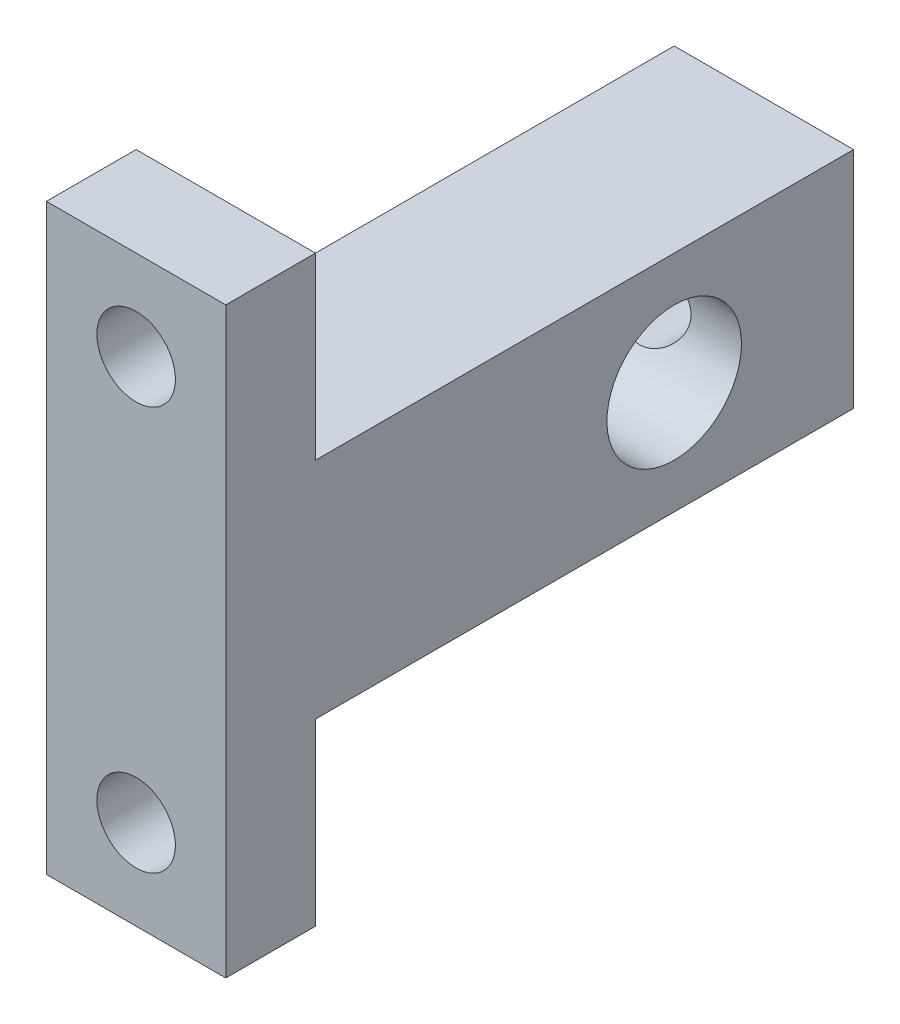
ISO-10303-21;
HEADER;
FILE_DESCRIPTION(('STEP AP214'),'2;1');
FILE_NAME('part.step','',(''),(''),'','','');
FILE_SCHEMA(('AUTOMOTIVE_DESIGN { 1 0 10303 214 1 1 1 1 }'));
ENDSEC;
DATA;
#1=APPLICATION_CONTEXT('core data for automotive mechanical design processes');
#2=APPLICATION_PROTOCOL_DEFINITION('international standard','automotive_design',2000,#1);
#3=PRODUCT_CONTEXT('',#1,'mechanical');
#4=PRODUCT('Part','Part','',(#3));
#5=PRODUCT_RELATED_PRODUCT_CATEGORY('part','',(#4));
#6=PRODUCT_DEFINITION_FORMATION('','',#4);
#7=PRODUCT_DEFINITION_CONTEXT('part definition',#1,'design');
#8=PRODUCT_DEFINITION('design','',#6,#7);
#9=PRODUCT_DEFINITION_SHAPE('','',#8);
#10=(LENGTH_UNIT() NAMED_UNIT(*) SI_UNIT(.MILLI.,.METRE.));
#11=(NAMED_UNIT(*) PLANE_ANGLE_UNIT() SI_UNIT($,.RADIAN.));
#12=(NAMED_UNIT(*) SI_UNIT($,.STERADIAN.) SOLID_ANGLE_UNIT());
#13=UNCERTAINTY_MEASURE_WITH_UNIT(LENGTH_MEASURE(1.E-05),#10,'distance_accuracy_value','');
#14=(GEOMETRIC_REPRESENTATION_CONTEXT(3) GLOBAL_UNCERTAINTY_ASSIGNED_CONTEXT((#13)) GLOBAL_UNIT_ASSIGNED_CONTEXT((#10,
#11,#12)) REPRESENTATION_CONTEXT('',''));
#15=CARTESIAN_POINT('',(0.,0.,0.));
#16=DIRECTION('',(0.,0.,1.));
#17=DIRECTION('',(1.,0.,0.));
#18=AXIS2_PLACEMENT_3D('',#15,#16,#17);
#19=CARTESIAN_POINT('',(0.,0.,0.));
#20=DIRECTION('',(0.,0.,1.));
#21=DIRECTION('',(1.,0.,0.));
#22=AXIS2_PLACEMENT_3D('',#19,#20,#21);
#23=PLANE('',#22);
#24=CARTESIAN_POINT('',(0.,-9.,0.));
#25=DIRECTION('',(0.,0.,-1.));
#26=DIRECTION('',(-1.,0.,0.));
#27=AXIS2_PLACEMENT_3D('',#24,#25,#26);
#28=CIRCLE('',#27,1.75);
#29=CARTESIAN_POINT('',(-1.75,-9.,0.));
#30=VERTEX_POINT('',#29);
#31=EDGE_CURVE('E127',#30,#30,#28,.T.);
#32=ORIENTED_EDGE('',*,*,#31,.F.);
#33=EDGE_LOOP('',(#32));
#34=FACE_BOUND('',#33,.T.);
#35=DIRECTION('',(-1.,0.,0.));
#36=VECTOR('',#35,1.);
#37=CARTESIAN_POINT('',(4.,-5.,0.));
#38=LINE('',#37,#36);
#39=CARTESIAN_POINT('',(4.,-4.99999999999999,0.));
#40=VERTEX_POINT('',#39);
#41=CARTESIAN_POINT('',(-4.,-4.99999999999999,0.));
#42=VERTEX_POINT('',#41);
#43=EDGE_CURVE('E122',#40,#42,#38,.T.);
#44=ORIENTED_EDGE('',*,*,#43,.F.);
#45=DIRECTION('',(0.,1.,0.));
#46=VECTOR('',#45,1.);
#47=CARTESIAN_POINT('',(4.,13.,0.));
#48=LINE('',#47,#46);
#49=CARTESIAN_POINT('',(4.,-13.,0.));
#50=VERTEX_POINT('',#49);
#51=EDGE_CURVE('E176',#50,#40,#48,.T.);
#52=ORIENTED_EDGE('',*,*,#51,.F.);
#53=DIRECTION('',(1.,0.,0.));
#54=VECTOR('',#53,1.);
#55=CARTESIAN_POINT('',(-4.,-13.,0.));
#56=LINE('',#55,#54);
#57=CARTESIAN_POINT('',(-4.,-13.,0.));
#58=VERTEX_POINT('',#57);
#59=EDGE_CURVE('E161',#58,#50,#56,.T.);
#60=ORIENTED_EDGE('',*,*,#59,.F.);
#61=DIRECTION('',(0.,-1.,0.));
#62=VECTOR('',#61,1.);
#63=CARTESIAN_POINT('',(-4.,13.,0.));
#64=LINE('',#63,#62);
#65=EDGE_CURVE('E52',#42,#58,#64,.T.);
#66=ORIENTED_EDGE('',*,*,#65,.F.);
#67=EDGE_LOOP('',(#44,#52,#60,#66));
#68=FACE_BOUND('',#67,.T.);
#69=ADVANCED_FACE('F35',(#34,#68),#23,.F.);
#70=CARTESIAN_POINT('',(0.,9.,0.));
#71=DIRECTION('',(0.,0.,-1.));
#72=DIRECTION('',(-1.,0.,0.));
#73=AXIS2_PLACEMENT_3D('',#70,#71,#72);
#74=CIRCLE('',#73,1.75);
#75=CARTESIAN_POINT('',(-1.75,9.,0.));
#76=VERTEX_POINT('',#75);
#77=EDGE_CURVE('E149',#76,#76,#74,.T.);
#78=ORIENTED_EDGE('',*,*,#77,.F.);
#79=EDGE_LOOP('',(#78));
#80=FACE_BOUND('',#79,.T.);
#81=DIRECTION('',(1.,0.,0.));
#82=VECTOR('',#81,1.);
#83=CARTESIAN_POINT('',(4.,5.,0.));
#84=LINE('',#83,#82);
#85=CARTESIAN_POINT('',(-4.,5.00000000000001,0.));
#86=VERTEX_POINT('',#85);
#87=CARTESIAN_POINT('',(4.,5.,0.));
#88=VERTEX_POINT('',#87);
#89=EDGE_CURVE('E60',#86,#88,#84,.T.);
#90=ORIENTED_EDGE('',*,*,#89,.F.);
#91=CARTESIAN_POINT('',(-4.,13.,0.));
#92=VERTEX_POINT('',#91);
#93=EDGE_CURVE('E126',#92,#86,#64,.T.);
#94=ORIENTED_EDGE('',*,*,#93,.F.);
#95=DIRECTION('',(-1.,0.,0.));
#96=VECTOR('',#95,1.);
#97=CARTESIAN_POINT('',(-4.,13.,0.));
#98=LINE('',#97,#96);
#99=CARTESIAN_POINT('',(4.,13.,0.));
#100=VERTEX_POINT('',#99);
#101=EDGE_CURVE('E170',#100,#92,#98,.T.);
#102=ORIENTED_EDGE('',*,*,#101,.F.);
#103=EDGE_CURVE('E154',#88,#100,#48,.T.);
#104=ORIENTED_EDGE('',*,*,#103,.F.);
#105=EDGE_LOOP('',(#90,#94,#102,#104));
#106=FACE_BOUND('',#105,.T.);
#107=ADVANCED_FACE('F196',(#80,#106),#23,.F.);
#108=CARTESIAN_POINT('',(4.,13.,4.));
#109=DIRECTION('',(-1.,0.,0.));
#110=DIRECTION('',(0.,-1.,0.));
#111=AXIS2_PLACEMENT_3D('',#108,#109,#110);
#112=PLANE('',#111);
#113=CARTESIAN_POINT('',(4.,0.,-16.));
#114=DIRECTION('',(1.,0.,0.));
#115=DIRECTION('',(0.,1.,0.));
#116=AXIS2_PLACEMENT_3D('',#113,#114,#115);
#117=CIRCLE('',#116,3.);
#118=CARTESIAN_POINT('',(4.,3.,-16.));
#119=VERTEX_POINT('',#118);
#120=EDGE_CURVE('E343',#119,#119,#117,.T.);
#121=ORIENTED_EDGE('',*,*,#120,.F.);
#122=EDGE_LOOP('',(#121));
#123=FACE_BOUND('',#122,.T.);
#124=ORIENTED_EDGE('',*,*,#51,.T.);
#125=DIRECTION('',(0.,0.,1.));
#126=VECTOR('',#125,1.);
#127=CARTESIAN_POINT('',(4.,-5.,-24.));
#128=LINE('',#127,#126);
#129=CARTESIAN_POINT('',(4.,-5.,-24.));
#130=VERTEX_POINT('',#129);
#131=EDGE_CURVE('E132',#130,#40,#128,.T.);
#132=ORIENTED_EDGE('',*,*,#131,.F.);
#133=DIRECTION('',(0.,-1.,0.));
#134=VECTOR('',#133,1.);
#135=CARTESIAN_POINT('',(4.,5.,-24.));
#136=LINE('',#135,#134);
#137=CARTESIAN_POINT('',(4.,5.,-24.));
#138=VERTEX_POINT('',#137);
#139=EDGE_CURVE('E112',#138,#130,#136,.T.);
#140=ORIENTED_EDGE('',*,*,#139,.F.);
#141=DIRECTION('',(0.,0.,1.));
#142=VECTOR('',#141,1.);
#143=CARTESIAN_POINT('',(4.,5.,-24.));
#144=LINE('',#143,#142);
#145=EDGE_CURVE('E109',#138,#88,#144,.T.);
#146=ORIENTED_EDGE('',*,*,#145,.T.);
#147=ORIENTED_EDGE('',*,*,#103,.T.);
#148=DIRECTION('',(0.,0.,-1.));
#149=VECTOR('',#148,1.);
#150=CARTESIAN_POINT('',(4.,13.,4.));
#151=LINE('',#150,#149);
#152=CARTESIAN_POINT('',(4.,13.,4.));
#153=VERTEX_POINT('',#152);
#154=EDGE_CURVE('E11',#153,#100,#151,.T.);
#155=ORIENTED_EDGE('',*,*,#154,.F.);
#156=DIRECTION('',(0.,1.,0.));
#157=VECTOR('',#156,1.);
#158=CARTESIAN_POINT('',(4.,13.,4.));
#159=LINE('',#158,#157);
#160=CARTESIAN_POINT('',(4.,-13.,4.));
#161=VERTEX_POINT('',#160);
#162=EDGE_CURVE('E157',#161,#153,#159,.T.);
#163=ORIENTED_EDGE('',*,*,#162,.F.);
#164=DIRECTION('',(0.,0.,-1.));
#165=VECTOR('',#164,1.);
#166=CARTESIAN_POINT('',(4.,-13.,4.));
#167=LINE('',#166,#165);
#168=EDGE_CURVE('E167',#161,#50,#167,.T.);
#169=ORIENTED_EDGE('',*,*,#168,.T.);
#170=EDGE_LOOP('',(#124,#132,#140,#146,#147,#155,#163,#169));
#171=FACE_BOUND('',#170,.T.);
#172=ADVANCED_FACE('F37',(#123,#171),#112,.F.);
#173=CARTESIAN_POINT('',(-4.,13.,4.));
#174=DIRECTION('',(0.,-1.,0.));
#175=DIRECTION('',(0.,0.,-1.));
#176=AXIS2_PLACEMENT_3D('',#173,#174,#175);
#177=PLANE('',#176);
#178=ORIENTED_EDGE('',*,*,#101,.T.);
#179=DIRECTION('',(0.,0.,-1.));
#180=VECTOR('',#179,1.);
#181=CARTESIAN_POINT('',(-4.,13.,4.));
#182=LINE('',#181,#180);
#183=CARTESIAN_POINT('',(-4.,13.,4.));
#184=VERTEX_POINT('',#183);
#185=EDGE_CURVE('E44',#184,#92,#182,.T.);
#186=ORIENTED_EDGE('',*,*,#185,.F.);
#187=DIRECTION('',(-1.,0.,0.));
#188=VECTOR('',#187,1.);
#189=CARTESIAN_POINT('',(-4.,13.,4.));
#190=LINE('',#189,#188);
#191=EDGE_CURVE('E160',#153,#184,#190,.T.);
#192=ORIENTED_EDGE('',*,*,#191,.F.);
#193=ORIENTED_EDGE('',*,*,#154,.T.);
#194=EDGE_LOOP('',(#178,#186,#192,#193));
#195=FACE_BOUND('',#194,.T.);
#196=ADVANCED_FACE('F193',(#195),#177,.F.);
#197=CARTESIAN_POINT('',(-4.,13.,4.));
#198=DIRECTION('',(1.,0.,0.));
#199=DIRECTION('',(0.,1.,0.));
#200=AXIS2_PLACEMENT_3D('',#197,#198,#199);
#201=PLANE('',#200);
#202=CARTESIAN_POINT('',(-4.,0.,-16.));
#203=DIRECTION('',(1.,0.,0.));
#204=DIRECTION('',(0.,1.,0.));
#205=AXIS2_PLACEMENT_3D('',#202,#203,#204);
#206=CIRCLE('',#205,3.);
#207=CARTESIAN_POINT('',(-4.,3.,-16.));
#208=VERTEX_POINT('',#207);
#209=EDGE_CURVE('E39',#208,#208,#206,.T.);
#210=ORIENTED_EDGE('',*,*,#209,.T.);
#211=EDGE_LOOP('',(#210));
#212=FACE_BOUND('',#211,.T.);
#213=ORIENTED_EDGE('',*,*,#93,.T.);
#214=DIRECTION('',(0.,0.,1.));
#215=VECTOR('',#214,1.);
#216=CARTESIAN_POINT('',(-4.,5.,-24.));
#217=LINE('',#216,#215);
#218=CARTESIAN_POINT('',(-4.,5.,-24.));
#219=VERTEX_POINT('',#218);
#220=EDGE_CURVE('E107',#219,#86,#217,.T.);
#221=ORIENTED_EDGE('',*,*,#220,.F.);
#222=DIRECTION('',(0.,1.,0.));
#223=VECTOR('',#222,1.);
#224=CARTESIAN_POINT('',(-4.,5.,-24.));
#225=LINE('',#224,#223);
#226=CARTESIAN_POINT('',(-4.,-5.,-24.));
#227=VERTEX_POINT('',#226);
#228=EDGE_CURVE('E113',#227,#219,#225,.T.);
#229=ORIENTED_EDGE('',*,*,#228,.F.);
#230=DIRECTION('',(0.,0.,1.));
#231=VECTOR('',#230,1.);
#232=CARTESIAN_POINT('',(-4.,-5.,-24.));
#233=LINE('',#232,#231);
#234=EDGE_CURVE('E141',#227,#42,#233,.T.);
#235=ORIENTED_EDGE('',*,*,#234,.T.);
#236=ORIENTED_EDGE('',*,*,#65,.T.);
#237=DIRECTION('',(0.,0.,-1.));
#238=VECTOR('',#237,1.);
#239=CARTESIAN_POINT('',(-4.,-13.,4.));
#240=LINE('',#239,#238);
#241=CARTESIAN_POINT('',(-4.,-13.,4.));
#242=VERTEX_POINT('',#241);
#243=EDGE_CURVE('E180',#242,#58,#240,.T.);
#244=ORIENTED_EDGE('',*,*,#243,.F.);
#245=DIRECTION('',(0.,-1.,0.));
#246=VECTOR('',#245,1.);
#247=CARTESIAN_POINT('',(-4.,13.,4.));
#248=LINE('',#247,#246);
#249=EDGE_CURVE('E163',#184,#242,#248,.T.);
#250=ORIENTED_EDGE('',*,*,#249,.F.);
#251=ORIENTED_EDGE('',*,*,#185,.T.);
#252=EDGE_LOOP('',(#213,#221,#229,#235,#236,#244,#250,#251));
#253=FACE_BOUND('',#252,.T.);
#254=ADVANCED_FACE('F124',(#212,#253),#201,.F.);
#255=CARTESIAN_POINT('',(-4.,-13.,4.));
#256=DIRECTION('',(0.,1.,0.));
#257=DIRECTION('',(0.,0.,1.));
#258=AXIS2_PLACEMENT_3D('',#255,#256,#257);
#259=PLANE('',#258);
#260=ORIENTED_EDGE('',*,*,#59,.T.);
#261=ORIENTED_EDGE('',*,*,#168,.F.);
#262=DIRECTION('',(1.,0.,0.));
#263=VECTOR('',#262,1.);
#264=CARTESIAN_POINT('',(-4.,-13.,4.));
#265=LINE('',#264,#263);
#266=EDGE_CURVE('E165',#242,#161,#265,.T.);
#267=ORIENTED_EDGE('',*,*,#266,.F.);
#268=ORIENTED_EDGE('',*,*,#243,.T.);
#269=EDGE_LOOP('',(#260,#261,#267,#268));
#270=FACE_BOUND('',#269,.T.);
#271=ADVANCED_FACE('F211',(#270),#259,.F.);
#272=CARTESIAN_POINT('',(0.,0.,4.));
#273=DIRECTION('',(0.,0.,1.));
#274=DIRECTION('',(1.,0.,0.));
#275=AXIS2_PLACEMENT_3D('',#272,#273,#274);
#276=PLANE('',#275);
#277=CARTESIAN_POINT('',(0.,-9.,4.));
#278=DIRECTION('',(0.,0.,-1.));
#279=DIRECTION('',(-1.,0.,0.));
#280=AXIS2_PLACEMENT_3D('',#277,#278,#279);
#281=CIRCLE('',#280,1.75);
#282=CARTESIAN_POINT('',(-1.75,-9.,4.));
#283=VERTEX_POINT('',#282);
#284=EDGE_CURVE('E130',#283,#283,#281,.T.);
#285=ORIENTED_EDGE('',*,*,#284,.T.);
#286=EDGE_LOOP('',(#285));
#287=FACE_BOUND('',#286,.T.);
#288=CARTESIAN_POINT('',(0.,9.,4.));
#289=DIRECTION('',(0.,0.,-1.));
#290=DIRECTION('',(-1.,0.,0.));
#291=AXIS2_PLACEMENT_3D('',#288,#289,#290);
#292=CIRCLE('',#291,1.75);
#293=CARTESIAN_POINT('',(-1.75,9.,4.));
#294=VERTEX_POINT('',#293);
#295=EDGE_CURVE('E151',#294,#294,#292,.T.);
#296=ORIENTED_EDGE('',*,*,#295,.T.);
#297=EDGE_LOOP('',(#296));
#298=FACE_BOUND('',#297,.T.);
#299=ORIENTED_EDGE('',*,*,#162,.T.);
#300=ORIENTED_EDGE('',*,*,#191,.T.);
#301=ORIENTED_EDGE('',*,*,#249,.T.);
#302=ORIENTED_EDGE('',*,*,#266,.T.);
#303=EDGE_LOOP('',(#299,#300,#301,#302));
#304=FACE_BOUND('',#303,.T.);
#305=ADVANCED_FACE('F209',(#287,#298,#304),#276,.T.);
#306=CARTESIAN_POINT('',(0.,9.,4.));
#307=DIRECTION('',(0.,0.,-1.));
#308=DIRECTION('',(-1.,0.,0.));
#309=AXIS2_PLACEMENT_3D('',#306,#307,#308);
#310=CYLINDRICAL_SURFACE('',#309,1.75);
#311=ORIENTED_EDGE('',*,*,#295,.F.);
#312=EDGE_LOOP('',(#311));
#313=FACE_BOUND('',#312,.T.);
#314=ORIENTED_EDGE('',*,*,#77,.T.);
#315=EDGE_LOOP('',(#314));
#316=FACE_BOUND('',#315,.T.);
#317=ADVANCED_FACE('F237',(#313,#316),#310,.F.);
#318=CARTESIAN_POINT('',(0.,-9.,4.));
#319=DIRECTION('',(0.,0.,-1.));
#320=DIRECTION('',(-1.,0.,0.));
#321=AXIS2_PLACEMENT_3D('',#318,#319,#320);
#322=CYLINDRICAL_SURFACE('',#321,1.75);
#323=ORIENTED_EDGE('',*,*,#284,.F.);
#324=EDGE_LOOP('',(#323));
#325=FACE_BOUND('',#324,.T.);
#326=ORIENTED_EDGE('',*,*,#31,.T.);
#327=EDGE_LOOP('',(#326));
#328=FACE_BOUND('',#327,.T.);
#329=ADVANCED_FACE('F244',(#325,#328),#322,.F.);
#330=CARTESIAN_POINT('',(4.,5.,-24.));
#331=DIRECTION('',(0.,-1.,0.));
#332=DIRECTION('',(0.,0.,-1.));
#333=AXIS2_PLACEMENT_3D('',#330,#331,#332);
#334=PLANE('',#333);
#335=ORIENTED_EDGE('',*,*,#89,.T.);
#336=ORIENTED_EDGE('',*,*,#145,.F.);
#337=DIRECTION('',(1.,0.,0.));
#338=VECTOR('',#337,1.);
#339=CARTESIAN_POINT('',(4.,5.,-24.));
#340=LINE('',#339,#338);
#341=EDGE_CURVE('E103',#219,#138,#340,.T.);
#342=ORIENTED_EDGE('',*,*,#341,.F.);
#343=ORIENTED_EDGE('',*,*,#220,.T.);
#344=EDGE_LOOP('',(#335,#336,#342,#343));
#345=FACE_BOUND('',#344,.T.);
#346=ADVANCED_FACE('F105',(#345),#334,.F.);
#347=CARTESIAN_POINT('',(4.,-5.,-24.));
#348=DIRECTION('',(0.,1.,0.));
#349=DIRECTION('',(0.,0.,1.));
#350=AXIS2_PLACEMENT_3D('',#347,#348,#349);
#351=PLANE('',#350);
#352=ORIENTED_EDGE('',*,*,#43,.T.);
#353=ORIENTED_EDGE('',*,*,#234,.F.);
#354=DIRECTION('',(-1.,0.,0.));
#355=VECTOR('',#354,1.);
#356=CARTESIAN_POINT('',(4.,-5.,-24.));
#357=LINE('',#356,#355);
#358=EDGE_CURVE('E118',#130,#227,#357,.T.);
#359=ORIENTED_EDGE('',*,*,#358,.F.);
#360=ORIENTED_EDGE('',*,*,#131,.T.);
#361=EDGE_LOOP('',(#352,#353,#359,#360));
#362=FACE_BOUND('',#361,.T.);
#363=ADVANCED_FACE('F259',(#362),#351,.F.);
#364=CARTESIAN_POINT('',(0.,0.,-24.));
#365=DIRECTION('',(0.,0.,-1.));
#366=DIRECTION('',(-1.,0.,0.));
#367=AXIS2_PLACEMENT_3D('',#364,#365,#366);
#368=PLANE('',#367);
#369=CARTESIAN_POINT('',(0.,0.,-24.));
#370=DIRECTION('',(0.,0.,-1.));
#371=DIRECTION('',(-1.,0.,0.));
#372=AXIS2_PLACEMENT_3D('',#369,#370,#371);
#373=CIRCLE('',#372,1.75);
#374=CARTESIAN_POINT('',(-1.75,0.,-24.));
#375=VERTEX_POINT('',#374);
#376=EDGE_CURVE('E344',#375,#375,#373,.T.);
#377=ORIENTED_EDGE('',*,*,#376,.F.);
#378=EDGE_LOOP('',(#377));
#379=FACE_BOUND('',#378,.T.);
#380=ORIENTED_EDGE('',*,*,#228,.T.);
#381=ORIENTED_EDGE('',*,*,#341,.T.);
#382=ORIENTED_EDGE('',*,*,#139,.T.);
#383=ORIENTED_EDGE('',*,*,#358,.T.);
#384=EDGE_LOOP('',(#380,#381,#382,#383));
#385=FACE_BOUND('',#384,.T.);
#386=ADVANCED_FACE('F116',(#379,#385),#368,.T.);
#387=CARTESIAN_POINT('',(-16.,0.,-16.));
#388=DIRECTION('',(1.,0.,0.));
#389=DIRECTION('',(0.,1.,0.));
#390=AXIS2_PLACEMENT_3D('',#387,#388,#389);
#391=CYLINDRICAL_SURFACE('',#390,3.);
#392=CARTESIAN_POINT('',(-1.75,0.,-19.));
#393=CARTESIAN_POINT('',(-1.74999248972487,-0.0899260943450847,-18.9999933872255));
#394=CARTESIAN_POINT('',(-1.74301987382529,-0.179998893749567,-18.9959117012381));
#395=CARTESIAN_POINT('',(-1.71546522932054,-0.357477608462208,-18.9799664134664));
#396=CARTESIAN_POINT('',(-1.69484514108685,-0.444875348469012,-18.9680810497795));
#397=CARTESIAN_POINT('',(-1.64112996859846,-0.614025151526458,-18.9377406464476));
#398=CARTESIAN_POINT('',(-1.60809646335376,-0.695802763517555,-18.9193180606085));
#399=CARTESIAN_POINT('',(-1.53085669483119,-0.852413327579683,-18.8774937293753));
#400=CARTESIAN_POINT('',(-1.48665424682008,-0.927248639202855,-18.8540936846924));
#401=CARTESIAN_POINT('',(-1.38467380981755,-1.07412994865769,-18.8022756875161));
#402=CARTESIAN_POINT('',(-1.3261327887342,-1.14555876319282,-18.7736144392163));
#403=CARTESIAN_POINT('',(-1.19883358016628,-1.2781872761086,-18.7150516255849));
#404=CARTESIAN_POINT('',(-1.13006273861497,-1.33937410327363,-18.6851485576482));
#405=CARTESIAN_POINT('',(-0.974970860807191,-1.45686356139007,-18.6234392980714));
#406=CARTESIAN_POINT('',(-0.887542151008438,-1.51180708165682,-18.5918066326621));
#407=CARTESIAN_POINT('',(-0.702839006199147,-1.60599469056331,-18.5345285160236));
#408=CARTESIAN_POINT('',(-0.605580298791465,-1.64526337520153,-18.508873711244));
#409=CARTESIAN_POINT('',(-0.426811327418748,-1.69909798826494,-18.4726236141756));
#410=CARTESIAN_POINT('',(-0.346813873777063,-1.71726593207437,-18.4599229052408));
#411=CARTESIAN_POINT('',(-0.184255387094122,-1.74220880806771,-18.4423249974287));
#412=CARTESIAN_POINT('',(-0.101697385916509,-1.74899672707175,-18.4374189037159));
#413=CARTESIAN_POINT('',(0.0637461686224708,-1.75079751335569,-18.4361260357616));
#414=CARTESIAN_POINT('',(0.146632034346724,-1.74579159193087,-18.4397528552464));
#415=CARTESIAN_POINT('',(0.310158033237775,-1.72427221835426,-18.4550052736622));
#416=CARTESIAN_POINT('',(0.390796517286994,-1.70775053579178,-18.4666365934012));
#417=CARTESIAN_POINT('',(0.547244928154775,-1.66420416251994,-18.4962175952486));
#418=CARTESIAN_POINT('',(0.623086022668942,-1.63725766204425,-18.5141201483003));
#419=CARTESIAN_POINT('',(0.76939242100528,-1.57381751458139,-18.5543111884002));
#420=CARTESIAN_POINT('',(0.839855689877173,-1.53732027653726,-18.5766013243873));
#421=CARTESIAN_POINT('',(0.985859147917477,-1.44880386712598,-18.6275433945987));
#422=CARTESIAN_POINT('',(1.06029307260723,-1.39521241489436,-18.6566367408265));
#423=CARTESIAN_POINT('',(1.19984908546837,-1.27719426081561,-18.7153500964328));
#424=CARTESIAN_POINT('',(1.26496271741438,-1.21275783328051,-18.7449705570098));
#425=CARTESIAN_POINT('',(1.39218386074431,-1.06533337749026,-18.8057397511775));
#426=CARTESIAN_POINT('',(1.45291688747767,-0.981035653023084,-18.8366223828585));
#427=CARTESIAN_POINT('',(1.55913168561216,-0.801536482279144,-18.8924645083812));
#428=CARTESIAN_POINT('',(1.60462257875347,-0.706341603399293,-18.9174275422154));
#429=CARTESIAN_POINT('',(1.67565251931092,-0.51425110227148,-18.9571107689339));
#430=CARTESIAN_POINT('',(1.70232519226127,-0.417897866948716,-18.9724057010199));
#431=CARTESIAN_POINT('',(1.73885384221535,-0.221075458285347,-18.9934733765518));
#432=CARTESIAN_POINT('',(1.74872782237267,-0.120610809584667,-18.9992563137785));
#433=CARTESIAN_POINT('',(1.75089521955663,0.0677174039909328,-19.0005235952691));
#434=CARTESIAN_POINT('',(1.74526656793966,0.155557082863699,-18.9972251989739));
#435=CARTESIAN_POINT('',(1.72105536533678,0.328810809400088,-18.9831918220535));
#436=CARTESIAN_POINT('',(1.70247277144963,0.414224849029434,-18.9724568167996));
#437=CARTESIAN_POINT('',(1.65363274338209,0.579031092089092,-18.9447590850985));
#438=CARTESIAN_POINT('',(1.62356389544671,0.658496978005278,-18.9278971606239));
#439=CARTESIAN_POINT('',(1.5528733099519,0.811280788568506,-18.8892974657266));
#440=CARTESIAN_POINT('',(1.51224923301219,0.884597345554285,-18.8675586145653));
#441=CARTESIAN_POINT('',(1.41684661931519,1.03125054777328,-18.8183525181235));
#442=CARTESIAN_POINT('',(1.36103370963896,1.1037917379709,-18.790524289024));
#443=CARTESIAN_POINT('',(1.23918545597162,1.23903994969308,-18.7331646699408));
#444=CARTESIAN_POINT('',(1.17313823003125,1.30173536781872,-18.7036313256608));
#445=CARTESIAN_POINT('',(1.02343943938588,1.42318031383413,-18.6419174771264));
#446=CARTESIAN_POINT('',(0.938627302023174,1.4805627405233,-18.6098424416357));
#447=CARTESIAN_POINT('',(0.758949639109148,1.58019412669645,-18.5507551381831));
#448=CARTESIAN_POINT('',(0.664096698031465,1.62246174572416,-18.5237366475998));
#449=CARTESIAN_POINT('',(0.487726102533659,1.6826571444095,-18.4838837200922));
#450=CARTESIAN_POINT('',(0.407738892477661,1.70386706375962,-18.4692474384314));
#451=CARTESIAN_POINT('',(0.244604531707218,1.73480246090685,-18.4476165899701));
#452=CARTESIAN_POINT('',(0.161461445663501,1.74454222628975,-18.4406125170641));
#453=CARTESIAN_POINT('',(-0.0058766075665918,1.75199797784207,-18.4352675698696));
#454=CARTESIAN_POINT('',(-0.0900737943461836,1.74968171574835,-18.4369499305343));
#455=CARTESIAN_POINT('',(-0.256693919176282,1.73309765744759,-18.4487688322061));
#456=CARTESIAN_POINT('',(-0.339115744567241,1.71882257779048,-18.4589105253054));
#457=CARTESIAN_POINT('',(-0.497580640101788,1.67969834968853,-18.4857893341496));
#458=CARTESIAN_POINT('',(-0.573739961204532,1.6551721029676,-18.5023239766944));
#459=CARTESIAN_POINT('',(-0.720999433440058,1.59654281469426,-18.5401307925281));
#460=CARTESIAN_POINT('',(-0.792097656240059,1.56243614711979,-18.5614047589365));
#461=CARTESIAN_POINT('',(-0.938977555074874,1.47952471389623,-18.6102990399417));
#462=CARTESIAN_POINT('',(-1.01377806510041,1.42926140154466,-18.638391946195));
#463=CARTESIAN_POINT('',(-1.15461067161117,1.31811740411898,-18.69564120997));
#464=CARTESIAN_POINT('',(-1.22063582417425,1.25722839803791,-18.7247983866669));
#465=CARTESIAN_POINT('',(-1.35148772610751,1.11644726620308,-18.7857153224179));
#466=CARTESIAN_POINT('',(-1.4148493804778,1.03508780981762,-18.8172670507882));
#467=CARTESIAN_POINT('',(-1.5269745874304,0.861137847178952,-18.8752129249764));
#468=CARTESIAN_POINT('',(-1.57573471547556,0.768544713403454,-18.9016058603848));
#469=CARTESIAN_POINT('',(-1.65449901154867,0.578904287064571,-18.9451375099232));
#470=CARTESIAN_POINT('',(-1.68528311717588,0.48227658454607,-18.9626557940663));
#471=CARTESIAN_POINT('',(-1.71861607442946,0.333826312006087,-18.9817893589844));
#472=CARTESIAN_POINT('',(-1.72758362288797,0.283816471223511,-18.986974732725));
#473=CARTESIAN_POINT('',(-1.74114248124212,0.183023149242706,-18.9948360960392));
#474=CARTESIAN_POINT('',(-1.74573739924239,0.132240341083978,-18.9975141545109));
#475=CARTESIAN_POINT('',(-1.7493703562075,0.0542562694068423,-18.9996329533989));
#476=CARTESIAN_POINT('',(-1.75000226619333,0.0271348134861308,-19.0000019953764));
#477=CARTESIAN_POINT('',(-1.75,0.,-19.));
#478=B_SPLINE_CURVE_WITH_KNOTS('',3,(#392,#393,#394,#395,#396,#397,#398,#399,#400,#401,#402,
#403,#404,#405,#406,#407,#408,#409,#410,#411,#412,#413,#414,#415,#416,#417,#418,#419,#420,#421,
#422,#423,#424,#425,#426,#427,#428,#429,#430,#431,#432,#433,#434,#435,#436,#437,#438,#439,#440,
#441,#442,#443,#444,#445,#446,#447,#448,#449,#450,#451,#452,#453,#454,#455,#456,#457,#458,#459,
#460,#461,#462,#463,#464,#465,#466,#467,#468,#469,#470,#471,#472,#473,#474,#475,#476,#477),
.UNSPECIFIED.,.T.,.F.,(4,2,2,2,2,2,2,2,2,2,2,2,2,2,2,2,2,2,2,2,2,2,2,2,2,2,2,2,2,2,2,2,2,2,2,2,
2,2,2,2,2,2,4),(0.,0.269682848507375,0.540120966746718,0.809234867445781,1.07825696388483,
1.36720562389127,1.65651472601918,1.97891442487774,2.30080622610211,2.54877444581718,
2.79645949249157,3.04453939165374,3.29279677764287,3.53922714819383,3.78575030950588,
4.07329505075292,4.36109904743876,4.68459883014231,5.00790466534685,5.30952425878853,
5.61082040251298,5.87376281934726,6.13670610700591,6.39550593899182,6.65436317839365,
6.94021883480414,7.22640888861097,7.54680260063235,7.86679940325803,8.11784613873922,
8.36857983060695,8.61998454570948,8.87154248884005,9.11571156496425,9.35997317962994,
9.64208079618313,9.92441033147708,10.246312237478,10.5682895810184,10.8749947772205,
11.0280026433254,11.1808841442313,11.26225978773),.UNSPECIFIED.);
#479=CARTESIAN_POINT('',(-1.75,0.,-19.));
#480=VERTEX_POINT('',#479);
#481=EDGE_CURVE('E338',#480,#480,#478,.T.);
#482=ORIENTED_EDGE('',*,*,#481,.F.);
#483=EDGE_LOOP('',(#482));
#484=FACE_BOUND('',#483,.T.);
#485=ORIENTED_EDGE('',*,*,#120,.T.);
#486=EDGE_LOOP('',(#485));
#487=FACE_BOUND('',#486,.T.);
#488=ORIENTED_EDGE('',*,*,#209,.F.);
#489=EDGE_LOOP('',(#488));
#490=FACE_BOUND('',#489,.T.);
#491=ADVANCED_FACE('F272',(#484,#487,#490),#391,.F.);
#492=CARTESIAN_POINT('',(0.,0.,4.001));
#493=DIRECTION('',(0.,0.,-1.));
#494=DIRECTION('',(-1.,0.,0.));
#495=AXIS2_PLACEMENT_3D('',#492,#493,#494);
#496=CYLINDRICAL_SURFACE('',#495,1.75);
#497=ORIENTED_EDGE('',*,*,#481,.T.);
#498=EDGE_LOOP('',(#497));
#499=FACE_BOUND('',#498,.T.);
#500=ORIENTED_EDGE('',*,*,#376,.T.);
#501=EDGE_LOOP('',(#500));
#502=FACE_BOUND('',#501,.T.);
#503=ADVANCED_FACE('F280',(#499,#502),#496,.F.);
#504=CLOSED_SHELL('',(#69,#107,#172,#196,#254,#271,#305,#317,#329,#346,#363,#386,#491,#503));
#505=MANIFOLD_SOLID_BREP('B2',#504);
#506=ADVANCED_BREP_SHAPE_REPRESENTATION('',(#18,#505),#14);
#507=SHAPE_DEFINITION_REPRESENTATION(#9,#506);
ENDSEC;
END-ISO-10303-21;
